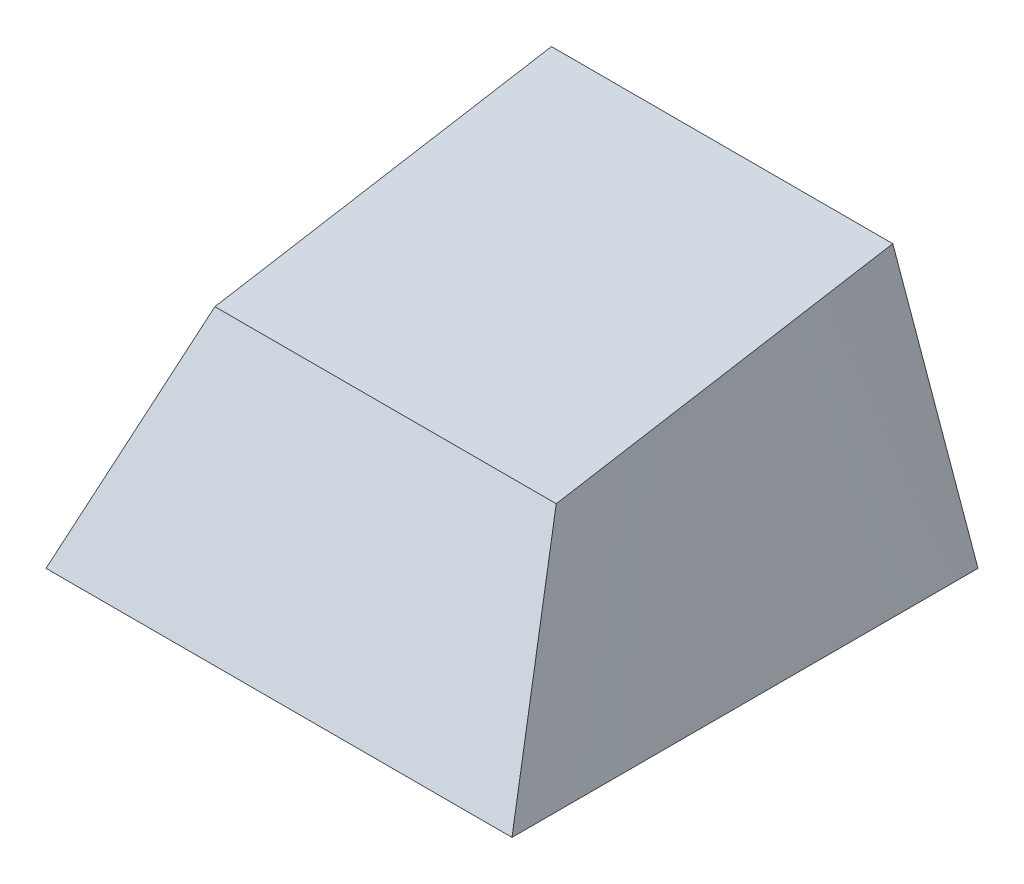
ISO-10303-21;
HEADER;
FILE_DESCRIPTION(('STEP AP214'),'2;1');
FILE_NAME('part.step','',(''),(''),'','','');
FILE_SCHEMA(('AUTOMOTIVE_DESIGN { 1 0 10303 214 1 1 1 1 }'));
ENDSEC;
DATA;
#1=APPLICATION_CONTEXT('core data for automotive mechanical design processes');
#2=APPLICATION_PROTOCOL_DEFINITION('international standard','automotive_design',2000,#1);
#3=PRODUCT_CONTEXT('',#1,'mechanical');
#4=PRODUCT('Part','Part','',(#3));
#5=PRODUCT_RELATED_PRODUCT_CATEGORY('part','',(#4));
#6=PRODUCT_DEFINITION_FORMATION('','',#4);
#7=PRODUCT_DEFINITION_CONTEXT('part definition',#1,'design');
#8=PRODUCT_DEFINITION('design','',#6,#7);
#9=PRODUCT_DEFINITION_SHAPE('','',#8);
#10=(LENGTH_UNIT() NAMED_UNIT(*) SI_UNIT(.MILLI.,.METRE.));
#11=(NAMED_UNIT(*) PLANE_ANGLE_UNIT() SI_UNIT($,.RADIAN.));
#12=(NAMED_UNIT(*) SI_UNIT($,.STERADIAN.) SOLID_ANGLE_UNIT());
#13=UNCERTAINTY_MEASURE_WITH_UNIT(LENGTH_MEASURE(1.E-05),#10,'distance_accuracy_value','');
#14=(GEOMETRIC_REPRESENTATION_CONTEXT(3) GLOBAL_UNCERTAINTY_ASSIGNED_CONTEXT((#13)) GLOBAL_UNIT_ASSIGNED_CONTEXT((#10,
#11,#12)) REPRESENTATION_CONTEXT('',''));
#15=CARTESIAN_POINT('',(0.,0.,0.));
#16=DIRECTION('',(0.,0.,1.));
#17=DIRECTION('',(1.,0.,0.));
#18=AXIS2_PLACEMENT_3D('',#15,#16,#17);
#19=CARTESIAN_POINT('',(0.,8.48350192905026,1.43566955722389));
#20=DIRECTION('',(0.,0.985980885458093,0.166858303692908));
#21=DIRECTION('',(0.,-0.166858303692908,0.985980885458093));
#22=AXIS2_PLACEMENT_3D('',#19,#20,#21);
#23=PLANE('',#22);
#24=DIRECTION('',(1.,0.,0.));
#25=VECTOR('',#24,1.);
#26=CARTESIAN_POINT('',(-6.59241988953979,7.9,4.88363550161177));
#27=LINE('',#26,#25);
#28=CARTESIAN_POINT('',(-6.59241988953979,7.9,4.88363550161177));
#29=VERTEX_POINT('',#28);
#30=CARTESIAN_POINT('',(6.5924198895398,7.9,4.88363550161176));
#31=VERTEX_POINT('',#30);
#32=EDGE_CURVE('E447',#29,#31,#27,.T.);
#33=ORIENTED_EDGE('',*,*,#32,.T.);
#34=DIRECTION('',(0.,0.166858303692908,-0.985980885458093));
#35=VECTOR('',#34,1.);
#36=CARTESIAN_POINT('',(6.5924198895398,7.9,4.88363550161176));
#37=LINE('',#36,#35);
#38=CARTESIAN_POINT('',(6.5924198895398,10.1,-8.11636449838823));
#39=VERTEX_POINT('',#38);
#40=EDGE_CURVE('E527',#31,#39,#37,.T.);
#41=ORIENTED_EDGE('',*,*,#40,.T.);
#42=DIRECTION('',(-1.,0.,0.));
#43=VECTOR('',#42,1.);
#44=CARTESIAN_POINT('',(-6.5924198895398,10.1,-8.11636449838823));
#45=LINE('',#44,#43);
#46=CARTESIAN_POINT('',(-6.5924198895398,10.1,-8.11636449838823));
#47=VERTEX_POINT('',#46);
#48=EDGE_CURVE('E63',#39,#47,#45,.T.);
#49=ORIENTED_EDGE('',*,*,#48,.T.);
#50=DIRECTION('',(0.,-0.166858303692908,0.985980885458093));
#51=VECTOR('',#50,1.);
#52=CARTESIAN_POINT('',(-6.59241988953979,7.9,4.88363550161177));
#53=LINE('',#52,#51);
#54=EDGE_CURVE('E14',#47,#29,#53,.T.);
#55=ORIENTED_EDGE('',*,*,#54,.T.);
#56=EDGE_LOOP('',(#33,#41,#49,#55));
#57=FACE_BOUND('',#56,.T.);
#58=ADVANCED_FACE('F52',(#57),#23,.T.);
#59=CARTESIAN_POINT('',(0.,0.,0.));
#60=DIRECTION('',(0.,1.,0.));
#61=DIRECTION('',(0.,0.,1.));
#62=AXIS2_PLACEMENT_3D('',#59,#60,#61);
#63=PLANE('',#62);
#64=DIRECTION('',(-1.,0.,0.));
#65=VECTOR('',#64,1.);
#66=CARTESIAN_POINT('',(0.,0.,-7.39388825993065));
#67=LINE('',#66,#65);
#68=CARTESIAN_POINT('',(7.35341894280521,-1.346579098227E-13,-7.3938882599308));
#69=VERTEX_POINT('',#68);
#70=CARTESIAN_POINT('',(-7.35341894280521,0.,-7.3938882599308));
#71=VERTEX_POINT('',#70);
#72=EDGE_CURVE('E751',#69,#71,#67,.T.);
#73=ORIENTED_EDGE('',*,*,#72,.T.);
#74=CARTESIAN_POINT('',(-7.3534189428052,0.,-7.3938882599308));
#75=CARTESIAN_POINT('',(-7.35138144162803,0.,-5.62573872568452));
#76=CARTESIAN_POINT('',(-7.34916787069443,0.,-3.85758932747076));
#77=CARTESIAN_POINT('',(-7.34451760340251,0.,-0.541895299182996));
#78=CARTESIAN_POINT('',(-7.34214320280169,0.,1.00564941974705));
#79=CARTESIAN_POINT('',(-7.33686552985169,0.,4.1007381145957));
#80=CARTESIAN_POINT('',(-7.33396225744588,0.,5.64828209051421));
#81=CARTESIAN_POINT('',(-7.33073407922755,0.,7.19582544865283));
#82=B_SPLINE_CURVE_WITH_KNOTS('',3,(#74,#75,#76,#77,#78,#79,#80,#81),.UNSPECIFIED.,.F.,.F.,(4,2,
2,4),(0.,5.30445222136777,9.94709177247256,14.5897318206672),.UNSPECIFIED.);
#83=CARTESIAN_POINT('',(-7.33073407922755,0.,7.19582544865283));
#84=VERTEX_POINT('',#83);
#85=EDGE_CURVE('E346',#71,#84,#82,.T.);
#86=ORIENTED_EDGE('',*,*,#85,.T.);
#87=DIRECTION('',(1.,0.,0.));
#88=VECTOR('',#87,1.);
#89=CARTESIAN_POINT('',(0.,0.,7.19582544865283));
#90=LINE('',#89,#88);
#91=CARTESIAN_POINT('',(7.33073407922755,0.,7.19582544865283));
#92=VERTEX_POINT('',#91);
#93=EDGE_CURVE('E752',#84,#92,#90,.T.);
#94=ORIENTED_EDGE('',*,*,#93,.T.);
#95=CARTESIAN_POINT('',(7.33073407922755,0.,7.19582544865283));
#96=CARTESIAN_POINT('',(7.33442892797053,0.,5.42324138907455));
#97=CARTESIAN_POINT('',(7.33770049917733,0.,3.65065653466032));
#98=CARTESIAN_POINT('',(7.34319794320016,0.,0.332745254032284));
#99=CARTESIAN_POINT('',(7.34550410713694,0.,-1.21258103787753));
#100=CARTESIAN_POINT('',(7.34972540879217,0.,-4.30323426860638));
#101=CARTESIAN_POINT('',(7.35164054648333,0.,-5.84856120742546));
#102=CARTESIAN_POINT('',(7.3534189428052,0.,-7.3938882599308));
#103=B_SPLINE_CURVE_WITH_KNOTS('',3,(#95,#96,#97,#98,#99,#100,#101,#102),.UNSPECIFIED.,.F.,.F.,
(4,2,2,4),(0.,5.31776354976349,9.9537475201381,14.5897318141445),.UNSPECIFIED.);
#104=EDGE_CURVE('E744',#92,#69,#103,.T.);
#105=ORIENTED_EDGE('',*,*,#104,.T.);
#106=EDGE_LOOP('',(#73,#86,#94,#105));
#107=FACE_BOUND('',#106,.T.);
#108=DIRECTION('',(0.,0.,1.));
#109=VECTOR('',#108,1.);
#110=CARTESIAN_POINT('',(-9.,0.,-9.));
#111=LINE('',#110,#109);
#112=CARTESIAN_POINT('',(-9.,0.,-9.));
#113=VERTEX_POINT('',#112);
#114=CARTESIAN_POINT('',(-9.,0.,9.));
#115=VERTEX_POINT('',#114);
#116=EDGE_CURVE('E463',#113,#115,#111,.T.);
#117=ORIENTED_EDGE('',*,*,#116,.F.);
#118=DIRECTION('',(-1.,0.,0.));
#119=VECTOR('',#118,1.);
#120=CARTESIAN_POINT('',(-9.,0.,-9.));
#121=LINE('',#120,#119);
#122=CARTESIAN_POINT('',(9.,0.,-9.));
#123=VERTEX_POINT('',#122);
#124=EDGE_CURVE('E455',#123,#113,#121,.T.);
#125=ORIENTED_EDGE('',*,*,#124,.F.);
#126=DIRECTION('',(0.,0.,-1.));
#127=VECTOR('',#126,1.);
#128=CARTESIAN_POINT('',(9.,0.,-9.));
#129=LINE('',#128,#127);
#130=CARTESIAN_POINT('',(9.,0.,9.));
#131=VERTEX_POINT('',#130);
#132=EDGE_CURVE('E496',#131,#123,#129,.T.);
#133=ORIENTED_EDGE('',*,*,#132,.F.);
#134=DIRECTION('',(1.,0.,0.));
#135=VECTOR('',#134,1.);
#136=CARTESIAN_POINT('',(-9.,0.,9.));
#137=LINE('',#136,#135);
#138=EDGE_CURVE('E481',#115,#131,#137,.T.);
#139=ORIENTED_EDGE('',*,*,#138,.F.);
#140=EDGE_LOOP('',(#117,#125,#133,#139));
#141=FACE_BOUND('',#140,.T.);
#142=ADVANCED_FACE('F530',(#107,#141),#63,.F.);
#143=CARTESIAN_POINT('',(-9.,0.,-9.));
#144=CARTESIAN_POINT('',(-6.5924198895398,10.1,-8.11636449838823));
#145=CARTESIAN_POINT('',(-9.,0.,-6.));
#146=CARTESIAN_POINT('',(-6.5924198895398,9.73333333333334,-5.94969783172159));
#147=CARTESIAN_POINT('',(-9.,0.,-3.));
#148=CARTESIAN_POINT('',(-6.5924198895398,9.36666666666667,-3.78303116505494));
#149=CARTESIAN_POINT('',(-9.,0.,3.));
#150=CARTESIAN_POINT('',(-6.5924198895398,8.63333333333334,0.550302168278397));
#151=CARTESIAN_POINT('',(-9.,0.,6.));
#152=CARTESIAN_POINT('',(-6.5924198895398,8.26666666666667,2.71696883494508));
#153=CARTESIAN_POINT('',(-9.,0.,9.));
#154=CARTESIAN_POINT('',(-6.59241988953979,7.9,4.88363550161177));
#155=B_SPLINE_SURFACE_WITH_KNOTS('',3,1,((#143,#144),(#145,#146),(#147,#148),(#149,#150),(#151,
#152),(#153,#154)),.UNSPECIFIED.,.F.,.F.,.F.,(4,2,4),(2,2),(0.,0.5,1.),(0.,1.),.UNSPECIFIED.);
#156=DIRECTION('',(0.260907238987357,0.856115723437394,-0.446086629173373));
#157=VECTOR('',#156,1.);
#158=CARTESIAN_POINT('',(-7.7962099447699,3.95,6.94181775080588));
#159=LINE('',#158,#157);
#160=EDGE_CURVE('E454',#115,#29,#159,.T.);
#161=DIRECTION('',(-0.231042205786163,-0.969241384036106,-0.0847976333233296));
#162=VECTOR('',#161,1.);
#163=CARTESIAN_POINT('',(-7.7962099447699,5.05,-8.55818224919411));
#164=LINE('',#163,#162);
#165=EDGE_CURVE('E451',#47,#113,#164,.T.);
#166=ORIENTED_EDGE('',*,*,#116,.T.);
#167=ORIENTED_EDGE('',*,*,#160,.T.);
#168=ORIENTED_EDGE('',*,*,#54,.F.);
#169=ORIENTED_EDGE('',*,*,#165,.T.);
#170=EDGE_LOOP('',(#166,#167,#168,#169));
#171=FACE_BOUND('',#170,.T.);
#172=ADVANCED_FACE('F386',(#171),#155,.T.);
#173=CARTESIAN_POINT('',(0.,3.68817994687276,7.07824139278805));
#174=DIRECTION('',(0.,-0.462091694509501,-0.886832152025026));
#175=DIRECTION('',(0.,0.886832152025026,-0.462091694509501));
#176=AXIS2_PLACEMENT_3D('',#173,#174,#175);
#177=PLANE('',#176);
#178=DIRECTION('',(-0.260907238987356,0.856115723437394,-0.446086629173373));
#179=VECTOR('',#178,1.);
#180=CARTESIAN_POINT('',(9.,0.,9.));
#181=LINE('',#180,#179);
#182=EDGE_CURVE('E448',#131,#31,#181,.T.);
#183=ORIENTED_EDGE('',*,*,#182,.T.);
#184=ORIENTED_EDGE('',*,*,#32,.F.);
#185=ORIENTED_EDGE('',*,*,#160,.F.);
#186=ORIENTED_EDGE('',*,*,#138,.T.);
#187=EDGE_LOOP('',(#183,#184,#185,#186));
#188=FACE_BOUND('',#187,.T.);
#189=ADVANCED_FACE('F428',(#188),#177,.F.);
#190=CARTESIAN_POINT('',(0.,0.781416799501128,-8.93163488855495));
#191=DIRECTION('',(0.,-0.0871557427476516,0.996194698091746));
#192=DIRECTION('',(0.,-0.996194698091746,-0.0871557427476516));
#193=AXIS2_PLACEMENT_3D('',#190,#191,#192);
#194=PLANE('',#193);
#195=ORIENTED_EDGE('',*,*,#165,.F.);
#196=ORIENTED_EDGE('',*,*,#48,.F.);
#197=DIRECTION('',(-0.231042205786163,0.969241384036106,0.0847976333233293));
#198=VECTOR('',#197,1.);
#199=CARTESIAN_POINT('',(7.7962099447699,5.05,-8.55818224919412));
#200=LINE('',#199,#198);
#201=EDGE_CURVE('E439',#123,#39,#200,.T.);
#202=ORIENTED_EDGE('',*,*,#201,.F.);
#203=ORIENTED_EDGE('',*,*,#124,.T.);
#204=EDGE_LOOP('',(#195,#196,#202,#203));
#205=FACE_BOUND('',#204,.T.);
#206=ADVANCED_FACE('F384',(#205),#194,.F.);
#207=CARTESIAN_POINT('',(9.,0.,9.));
#208=CARTESIAN_POINT('',(6.5924198895398,7.9,4.88363550161176));
#209=CARTESIAN_POINT('',(9.,0.,6.));
#210=CARTESIAN_POINT('',(6.5924198895398,8.26666666666667,2.7169688349451));
#211=CARTESIAN_POINT('',(9.,0.,3.));
#212=CARTESIAN_POINT('',(6.5924198895398,8.63333333333333,0.550302168278436));
#213=CARTESIAN_POINT('',(9.,0.,-3.));
#214=CARTESIAN_POINT('',(6.5924198895398,9.36666666666667,-3.7830311650549));
#215=CARTESIAN_POINT('',(9.,0.,-6.));
#216=CARTESIAN_POINT('',(6.5924198895398,9.73333333333333,-5.94969783172156));
#217=CARTESIAN_POINT('',(9.,0.,-9.));
#218=CARTESIAN_POINT('',(6.5924198895398,10.1,-8.11636449838823));
#219=B_SPLINE_SURFACE_WITH_KNOTS('',3,1,((#207,#208),(#209,#210),(#211,#212),(#213,#214),(#215,
#216),(#217,#218)),.UNSPECIFIED.,.F.,.F.,.F.,(4,2,4),(2,2),(0.,0.5,1.),(0.,1.),.UNSPECIFIED.);
#220=ORIENTED_EDGE('',*,*,#132,.T.);
#221=ORIENTED_EDGE('',*,*,#201,.T.);
#222=ORIENTED_EDGE('',*,*,#40,.F.);
#223=ORIENTED_EDGE('',*,*,#182,.F.);
#224=EDGE_LOOP('',(#220,#221,#222,#223));
#225=FACE_BOUND('',#224,.T.);
#226=ADVANCED_FACE('F379',(#225),#219,.T.);
#227=CARTESIAN_POINT('',(0.,6.90593251231731,1.16869627131524));
#228=DIRECTION('',(0.,0.985980885458093,0.166858303692908));
#229=DIRECTION('',(0.,-0.166858303692908,0.985980885458093));
#230=AXIS2_PLACEMENT_3D('',#227,#228,#229);
#231=PLANE('',#230);
#232=CARTESIAN_POINT('',(0.,7.10371188130912,0.));
#233=DIRECTION('',(0.,0.985980885458093,0.166858303692908));
#234=DIRECTION('',(0.,-0.166858303692908,0.985980885458093));
#235=AXIS2_PLACEMENT_3D('',#232,#233,#234);
#236=ELLIPSE('',#235,1.52132766681688,1.5);
#237=CARTESIAN_POINT('',(0.,6.84986572746296,1.5));
#238=VERTEX_POINT('',#237);
#239=EDGE_CURVE('E342',#238,#238,#236,.F.);
#240=ORIENTED_EDGE('',*,*,#239,.F.);
#241=EDGE_LOOP('',(#240));
#242=FACE_BOUND('',#241,.T.);
#243=DIRECTION('',(1.,0.,0.));
#244=VECTOR('',#243,1.);
#245=CARTESIAN_POINT('',(0.,6.45516825589243,3.83230324109861));
#246=LINE('',#245,#244);
#247=CARTESIAN_POINT('',(-5.42799400595446,6.45516825589243,3.83230324109861));
#248=VERTEX_POINT('',#247);
#249=CARTESIAN_POINT('',(5.42799400595447,6.45516825589243,3.83230324109861));
#250=VERTEX_POINT('',#249);
#251=EDGE_CURVE('E347',#248,#250,#246,.T.);
#252=ORIENTED_EDGE('',*,*,#251,.F.);
#253=CARTESIAN_POINT('',(-5.33943561858975,8.23308803972577,-6.67358639064383));
#254=CARTESIAN_POINT('',(-5.34539422303138,8.08492636337555,-5.79808557584711));
#255=CARTESIAN_POINT('',(-5.35163779788194,7.93676499418613,-4.92258657609146));
#256=CARTESIAN_POINT('',(-5.36479617387936,7.64044320324157,-3.17159417505542));
#257=CARTESIAN_POINT('',(-5.37171097450322,7.49228278148578,-2.2961007737712));
#258=CARTESIAN_POINT('',(-5.38631311759912,7.19596255938172,-0.545117643156276));
#259=CARTESIAN_POINT('',(-5.39400046230413,7.04780275903648,0.330372086156506));
#260=CARTESIAN_POINT('',(-5.410282759589,6.75148443525284,2.08134399942342));
#261=CARTESIAN_POINT('',(-5.41887771287604,6.60332591181554,2.95682618337115));
#262=CARTESIAN_POINT('',(-5.42799400595446,6.45516825589243,3.83230324109861));
#263=B_SPLINE_CURVE_WITH_KNOTS('',3,(#253,#254,#255,#256,#257,#258,#259,#260,#261,#262),
.UNSPECIFIED.,.F.,.F.,(4,2,2,2,4),(0.,2.66390725698839,5.32781243836378,7.99172531973815,
10.6556402767371),.UNSPECIFIED.);
#264=CARTESIAN_POINT('',(-5.33943561858974,8.23308803972577,-6.67358639064382));
#265=VERTEX_POINT('',#264);
#266=EDGE_CURVE('E768',#265,#248,#263,.T.);
#267=ORIENTED_EDGE('',*,*,#266,.F.);
#268=DIRECTION('',(-1.,0.,0.));
#269=VECTOR('',#268,1.);
#270=CARTESIAN_POINT('',(0.,8.23308803972576,-6.67358639064382));
#271=LINE('',#270,#269);
#272=CARTESIAN_POINT('',(5.33943561858975,8.23308803972576,-6.67358639064382));
#273=VERTEX_POINT('',#272);
#274=EDGE_CURVE('E361',#273,#265,#271,.T.);
#275=ORIENTED_EDGE('',*,*,#274,.F.);
#276=CARTESIAN_POINT('',(5.42799400595447,6.45516825589243,3.83230324109861));
#277=CARTESIAN_POINT('',(5.4188777415134,6.60332544560886,2.95682893822878));
#278=CARTESIAN_POINT('',(5.41028281364808,6.75148350283425,2.08134950916966));
#279=CARTESIAN_POINT('',(5.39400056192844,7.04780089418707,0.330383105721186));
#280=CARTESIAN_POINT('',(5.38631323736695,7.19596022831341,-0.545103868661752));
#281=CARTESIAN_POINT('',(5.37171108448456,7.49228045040397,-2.29608699919688));
#282=CARTESIAN_POINT('',(5.36479625879248,7.64044133837176,-3.17158315537018));
#283=CARTESIAN_POINT('',(5.35163783719837,7.93676406174703,-4.92258106622401));
#284=CARTESIAN_POINT('',(5.34539424181934,8.08492589715515,-5.79808282090837));
#285=CARTESIAN_POINT('',(5.33943561858975,8.23308803972576,-6.67358639064382));
#286=B_SPLINE_CURVE_WITH_KNOTS('',3,(#276,#277,#278,#279,#280,#281,#282,#283,#284,#285),
.UNSPECIFIED.,.F.,.F.,(4,2,2,2,4),(0.,2.66390657448004,5.32781107334719,7.99172463722881,
10.6556402767378),.UNSPECIFIED.);
#287=EDGE_CURVE('E350',#250,#273,#286,.T.);
#288=ORIENTED_EDGE('',*,*,#287,.F.);
#289=EDGE_LOOP('',(#252,#267,#275,#288));
#290=FACE_BOUND('',#289,.T.);
#291=ADVANCED_FACE('F363',(#242,#290),#231,.F.);
#292=CARTESIAN_POINT('',(-9.,0.,-9.));
#293=CARTESIAN_POINT('',(-6.5924198895398,10.1,-8.11636449838823));
#294=CARTESIAN_POINT('',(-9.,0.,-6.));
#295=CARTESIAN_POINT('',(-6.5924198895398,9.73333333333334,-5.94969783172159));
#296=CARTESIAN_POINT('',(-9.,0.,-3.));
#297=CARTESIAN_POINT('',(-6.5924198895398,9.36666666666667,-3.78303116505494));
#298=CARTESIAN_POINT('',(-9.,0.,3.));
#299=CARTESIAN_POINT('',(-6.5924198895398,8.63333333333334,0.550302168278397));
#300=CARTESIAN_POINT('',(-9.,0.,6.));
#301=CARTESIAN_POINT('',(-6.5924198895398,8.26666666666667,2.71696883494508));
#302=CARTESIAN_POINT('',(-9.,0.,9.));
#303=CARTESIAN_POINT('',(-6.59241988953979,7.9,4.88363550161177));
#304=B_SPLINE_SURFACE_WITH_KNOTS('',3,1,((#292,#293),(#294,#295),(#296,#297),(#298,#299),(#300,
#301),(#302,#303)),.UNSPECIFIED.,.F.,.F.,.F.,(4,2,4),(2,2),(0.,0.5,1.),(0.,1.),.UNSPECIFIED.);
#305=OFFSET_SURFACE('',#304,-1.6,.F.);
#306=ORIENTED_EDGE('',*,*,#85,.F.);
#307=CARTESIAN_POINT('',(-5.33943561858975,8.23308803972577,-6.67358639064383));
#308=CARTESIAN_POINT('',(-5.55035387009889,7.37780765762129,-6.74841372821392));
#309=CARTESIAN_POINT('',(-5.76064703879963,6.52237472728134,-6.82325441202539));
#310=CARTESIAN_POINT('',(-6.20195773173519,4.72259839109831,-6.98071443832366));
#311=CARTESIAN_POINT('',(-6.43286449642953,3.77822802755507,-7.06333613930363));
#312=CARTESIAN_POINT('',(-6.89375522810992,1.88926275677549,-7.22859918629112));
#313=CARTESIAN_POINT('',(-7.12373919413108,0.944667849305458,-7.3112405323191));
#314=CARTESIAN_POINT('',(-7.35341894280522,0.,-7.39388825993065));
#315=B_SPLINE_CURVE_WITH_KNOTS('',3,(#307,#308,#309,#310,#311,#312,#313,#314),.UNSPECIFIED.,.F.,
.F.,(4,2,2,4),(0.,2.65222676851535,5.5793094776204,8.50639524653459),.UNSPECIFIED.);
#316=EDGE_CURVE('E764',#265,#71,#315,.T.);
#317=ORIENTED_EDGE('',*,*,#316,.F.);
#318=ORIENTED_EDGE('',*,*,#266,.T.);
#319=CARTESIAN_POINT('',(-7.33073407922755,0.,7.19582544865283));
#320=CARTESIAN_POINT('',(-7.1053895459098,0.758129267050054,6.80079552459284));
#321=CARTESIAN_POINT('',(-6.88045990796542,1.51635630982733,6.40571465363002));
#322=CARTESIAN_POINT('',(-6.45017982481814,2.97117082504217,5.64767075208948));
#323=CARTESIAN_POINT('',(-6.24473054706996,3.66773531821386,5.2847196950604));
#324=CARTESIAN_POINT('',(-5.83522999095972,5.06118947438239,4.55864814840424));
#325=CARTESIAN_POINT('',(-5.63117871664425,5.75807913831422,4.19552765828998));
#326=CARTESIAN_POINT('',(-5.42799400595446,6.45516825589243,3.83230324109862));
#327=B_SPLINE_CURVE_WITH_KNOTS('',3,(#319,#320,#321,#322,#323,#324,#325,#326),.UNSPECIFIED.,.F.,
.F.,(4,2,2,4),(0.,2.65222658126589,5.08785788301822,7.52349623183257),.UNSPECIFIED.);
#328=EDGE_CURVE('E767',#84,#248,#327,.T.);
#329=ORIENTED_EDGE('',*,*,#328,.F.);
#330=EDGE_LOOP('',(#306,#317,#318,#329));
#331=FACE_BOUND('',#330,.T.);
#332=ADVANCED_FACE('F373',(#331),#305,.F.);
#333=CARTESIAN_POINT('',(0.,2.94883323565756,5.65930994954801));
#334=DIRECTION('',(0.,-0.462091694509501,-0.886832152025026));
#335=DIRECTION('',(0.,0.886832152025026,-0.462091694509501));
#336=AXIS2_PLACEMENT_3D('',#333,#334,#335);
#337=PLANE('',#336);
#338=CARTESIAN_POINT('',(7.33073407922755,0.,7.19582544865283));
#339=CARTESIAN_POINT('',(7.10482417349759,0.760031777350602,6.79980420486385));
#340=CARTESIAN_POINT('',(6.87933113278678,1.52016179601737,6.40373177157282));
#341=CARTESIAN_POINT('',(6.44877562947897,2.97592926228989,5.64519132650032));
#342=CARTESIAN_POINT('',(6.24360962843919,3.67154263697896,5.28273585812385));
#343=CARTESIAN_POINT('',(5.83467232219239,5.06309378293822,4.55765589167851));
#344=CARTESIAN_POINT('',(5.63090102101477,5.75903155513943,4.19503139312453));
#345=CARTESIAN_POINT('',(5.42799400595447,6.45516825589243,3.83230324109861));
#346=B_SPLINE_CURVE_WITH_KNOTS('',3,(#338,#339,#340,#341,#342,#343,#344,#345),.UNSPECIFIED.,.F.,
.F.,(4,2,2,4),(0.,2.65888219853341,5.0911857035178,7.52349623264637),.UNSPECIFIED.);
#347=EDGE_CURVE('E85',#92,#250,#346,.T.);
#348=ORIENTED_EDGE('',*,*,#347,.F.);
#349=ORIENTED_EDGE('',*,*,#93,.F.);
#350=ORIENTED_EDGE('',*,*,#328,.T.);
#351=ORIENTED_EDGE('',*,*,#251,.T.);
#352=EDGE_LOOP('',(#348,#349,#350,#351));
#353=FACE_BOUND('',#352,.T.);
#354=ADVANCED_FACE('F560',(#353),#337,.T.);
#355=CARTESIAN_POINT('',(0.,0.641967611104885,-7.33772337160815));
#356=DIRECTION('',(0.,-0.0871557427476516,0.996194698091746));
#357=DIRECTION('',(0.,-0.996194698091746,-0.0871557427476516));
#358=AXIS2_PLACEMENT_3D('',#355,#356,#357);
#359=PLANE('',#358);
#360=ORIENTED_EDGE('',*,*,#316,.T.);
#361=ORIENTED_EDGE('',*,*,#72,.F.);
#362=CARTESIAN_POINT('',(7.35341894280523,-1.4277790960578E-13,-7.39388825993066));
#363=CARTESIAN_POINT('',(7.14478796883499,0.858110446537223,-7.3188133238055));
#364=CARTESIAN_POINT('',(6.93590254572301,1.71615984061458,-7.24374372907844));
#365=CARTESIAN_POINT('',(6.4965456667623,3.51754768555666,-7.08614271403259));
#366=CARTESIAN_POINT('',(6.2659967805156,4.4608673926067,-7.00361293358509));
#367=CARTESIAN_POINT('',(5.80369561371954,6.34721551759625,-6.83857885718511));
#368=CARTESIAN_POINT('',(5.57194333140767,7.29024393510698,-6.75607456127015));
#369=CARTESIAN_POINT('',(5.33943561858975,8.23308803972576,-6.67358639064382));
#370=B_SPLINE_CURVE_WITH_KNOTS('',3,(#362,#363,#364,#365,#366,#367,#368,#369),.UNSPECIFIED.,.F.,
.F.,(4,2,2,4),(0.,2.65888187973236,5.58263640654219,8.50639521673185),.UNSPECIFIED.);
#371=EDGE_CURVE('E351',#69,#273,#370,.T.);
#372=ORIENTED_EDGE('',*,*,#371,.T.);
#373=ORIENTED_EDGE('',*,*,#274,.T.);
#374=EDGE_LOOP('',(#360,#361,#372,#373));
#375=FACE_BOUND('',#374,.T.);
#376=ADVANCED_FACE('F371',(#375),#359,.T.);
#377=CARTESIAN_POINT('',(9.,0.,9.));
#378=CARTESIAN_POINT('',(6.5924198895398,7.9,4.88363550161176));
#379=CARTESIAN_POINT('',(9.,0.,6.));
#380=CARTESIAN_POINT('',(6.5924198895398,8.26666666666667,2.7169688349451));
#381=CARTESIAN_POINT('',(9.,0.,3.));
#382=CARTESIAN_POINT('',(6.5924198895398,8.63333333333333,0.550302168278436));
#383=CARTESIAN_POINT('',(9.,0.,-3.));
#384=CARTESIAN_POINT('',(6.5924198895398,9.36666666666667,-3.7830311650549));
#385=CARTESIAN_POINT('',(9.,0.,-6.));
#386=CARTESIAN_POINT('',(6.5924198895398,9.73333333333333,-5.94969783172156));
#387=CARTESIAN_POINT('',(9.,0.,-9.));
#388=CARTESIAN_POINT('',(6.5924198895398,10.1,-8.11636449838823));
#389=B_SPLINE_SURFACE_WITH_KNOTS('',3,1,((#377,#378),(#379,#380),(#381,#382),(#383,#384),(#385,
#386),(#387,#388)),.UNSPECIFIED.,.F.,.F.,.F.,(4,2,4),(2,2),(0.,0.5,1.),(0.,1.),.UNSPECIFIED.);
#390=OFFSET_SURFACE('',#389,-1.6,.F.);
#391=ORIENTED_EDGE('',*,*,#104,.F.);
#392=ORIENTED_EDGE('',*,*,#347,.T.);
#393=ORIENTED_EDGE('',*,*,#287,.T.);
#394=ORIENTED_EDGE('',*,*,#371,.F.);
#395=EDGE_LOOP('',(#391,#392,#393,#394));
#396=FACE_BOUND('',#395,.T.);
#397=ADVANCED_FACE('F366',(#396),#390,.F.);
#398=CARTESIAN_POINT('',(0.,2.,0.));
#399=DIRECTION('',(0.,-1.,0.));
#400=DIRECTION('',(0.,0.,-1.));
#401=AXIS2_PLACEMENT_3D('',#398,#399,#400);
#402=PLANE('',#401);
#403=DIRECTION('',(1.,0.,0.));
#404=VECTOR('',#403,1.);
#405=CARTESIAN_POINT('',(0.,2.,-0.5));
#406=LINE('',#405,#404);
#407=CARTESIAN_POINT('',(-1.25,2.,-0.5));
#408=VERTEX_POINT('',#407);
#409=CARTESIAN_POINT('',(-0.5,2.,-0.5));
#410=VERTEX_POINT('',#409);
#411=EDGE_CURVE('E251',#408,#410,#406,.T.);
#412=ORIENTED_EDGE('',*,*,#411,.F.);
#413=DIRECTION('',(0.,0.,-1.));
#414=VECTOR('',#413,1.);
#415=CARTESIAN_POINT('',(-1.25,2.,0.));
#416=LINE('',#415,#414);
#417=CARTESIAN_POINT('',(-1.25,2.,0.5));
#418=VERTEX_POINT('',#417);
#419=EDGE_CURVE('E269',#418,#408,#416,.T.);
#420=ORIENTED_EDGE('',*,*,#419,.F.);
#421=DIRECTION('',(1.,0.,0.));
#422=VECTOR('',#421,1.);
#423=CARTESIAN_POINT('',(0.,2.,0.5));
#424=LINE('',#423,#422);
#425=CARTESIAN_POINT('',(-0.5,2.,0.5));
#426=VERTEX_POINT('',#425);
#427=EDGE_CURVE('E74',#418,#426,#424,.T.);
#428=ORIENTED_EDGE('',*,*,#427,.T.);
#429=DIRECTION('',(0.,0.,-1.));
#430=VECTOR('',#429,1.);
#431=CARTESIAN_POINT('',(-0.5,2.,0.));
#432=LINE('',#431,#430);
#433=CARTESIAN_POINT('',(-0.5,2.,1.25));
#434=VERTEX_POINT('',#433);
#435=EDGE_CURVE('E260',#434,#426,#432,.T.);
#436=ORIENTED_EDGE('',*,*,#435,.F.);
#437=DIRECTION('',(1.,0.,0.));
#438=VECTOR('',#437,1.);
#439=CARTESIAN_POINT('',(0.,2.,1.25));
#440=LINE('',#439,#438);
#441=CARTESIAN_POINT('',(0.5,2.,1.25));
#442=VERTEX_POINT('',#441);
#443=EDGE_CURVE('E283',#434,#442,#440,.T.);
#444=ORIENTED_EDGE('',*,*,#443,.T.);
#445=DIRECTION('',(0.,0.,-1.));
#446=VECTOR('',#445,1.);
#447=CARTESIAN_POINT('',(0.5,2.,0.));
#448=LINE('',#447,#446);
#449=CARTESIAN_POINT('',(0.5,2.,0.5));
#450=VERTEX_POINT('',#449);
#451=EDGE_CURVE('E315',#442,#450,#448,.T.);
#452=ORIENTED_EDGE('',*,*,#451,.T.);
#453=DIRECTION('',(1.,0.,0.));
#454=VECTOR('',#453,1.);
#455=CARTESIAN_POINT('',(0.,2.,0.5));
#456=LINE('',#455,#454);
#457=CARTESIAN_POINT('',(1.25,2.,0.5));
#458=VERTEX_POINT('',#457);
#459=EDGE_CURVE('E319',#450,#458,#456,.T.);
#460=ORIENTED_EDGE('',*,*,#459,.T.);
#461=DIRECTION('',(0.,0.,-1.));
#462=VECTOR('',#461,1.);
#463=CARTESIAN_POINT('',(1.25,2.,0.));
#464=LINE('',#463,#462);
#465=CARTESIAN_POINT('',(1.25,2.,-0.5));
#466=VERTEX_POINT('',#465);
#467=EDGE_CURVE('E323',#458,#466,#464,.T.);
#468=ORIENTED_EDGE('',*,*,#467,.T.);
#469=DIRECTION('',(1.,0.,0.));
#470=VECTOR('',#469,1.);
#471=CARTESIAN_POINT('',(0.,2.,-0.5));
#472=LINE('',#471,#470);
#473=CARTESIAN_POINT('',(0.5,2.,-0.5));
#474=VERTEX_POINT('',#473);
#475=EDGE_CURVE('E265',#474,#466,#472,.T.);
#476=ORIENTED_EDGE('',*,*,#475,.F.);
#477=DIRECTION('',(0.,0.,-1.));
#478=VECTOR('',#477,1.);
#479=CARTESIAN_POINT('',(0.5,2.,0.));
#480=LINE('',#479,#478);
#481=CARTESIAN_POINT('',(0.5,2.,-1.25));
#482=VERTEX_POINT('',#481);
#483=EDGE_CURVE('E300',#474,#482,#480,.T.);
#484=ORIENTED_EDGE('',*,*,#483,.T.);
#485=DIRECTION('',(1.,0.,0.));
#486=VECTOR('',#485,1.);
#487=CARTESIAN_POINT('',(0.,2.,-1.25));
#488=LINE('',#487,#486);
#489=CARTESIAN_POINT('',(-0.5,2.,-1.25));
#490=VERTEX_POINT('',#489);
#491=EDGE_CURVE('E917',#490,#482,#488,.T.);
#492=ORIENTED_EDGE('',*,*,#491,.F.);
#493=DIRECTION('',(0.,0.,-1.));
#494=VECTOR('',#493,1.);
#495=CARTESIAN_POINT('',(-0.5,2.,0.));
#496=LINE('',#495,#494);
#497=EDGE_CURVE('E897',#410,#490,#496,.T.);
#498=ORIENTED_EDGE('',*,*,#497,.F.);
#499=EDGE_LOOP('',(#412,#420,#428,#436,#444,#452,#460,#468,#476,#484,#492,#498));
#500=FACE_BOUND('',#499,.T.);
#501=CARTESIAN_POINT('',(0.,2.,0.));
#502=DIRECTION('',(0.,-1.,0.));
#503=DIRECTION('',(0.,0.,-1.));
#504=AXIS2_PLACEMENT_3D('',#501,#502,#503);
#505=CIRCLE('',#504,1.5);
#506=CARTESIAN_POINT('',(0.,2.,-1.5));
#507=VERTEX_POINT('',#506);
#508=EDGE_CURVE('E338',#507,#507,#505,.T.);
#509=ORIENTED_EDGE('',*,*,#508,.T.);
#510=EDGE_LOOP('',(#509));
#511=FACE_BOUND('',#510,.T.);
#512=ADVANCED_FACE('F370',(#500,#511),#402,.T.);
#513=CARTESIAN_POINT('',(0.,11.3765144440946,0.));
#514=DIRECTION('',(0.,-1.,0.));
#515=DIRECTION('',(0.,0.,-1.));
#516=AXIS2_PLACEMENT_3D('',#513,#514,#515);
#517=CYLINDRICAL_SURFACE('',#516,1.5);
#518=ORIENTED_EDGE('',*,*,#508,.F.);
#519=EDGE_LOOP('',(#518));
#520=FACE_BOUND('',#519,.T.);
#521=ORIENTED_EDGE('',*,*,#239,.T.);
#522=EDGE_LOOP('',(#521));
#523=FACE_BOUND('',#522,.T.);
#524=ADVANCED_FACE('F576',(#520,#523),#517,.T.);
#525=CARTESIAN_POINT('',(0.,6.41294206958826,1.08526711946878));
#526=DIRECTION('',(0.,0.985980885458093,0.166858303692908));
#527=DIRECTION('',(0.,-0.166858303692908,0.985980885458093));
#528=AXIS2_PLACEMENT_3D('',#525,#526,#527);
#529=PLANE('',#528);
#530=DIRECTION('',(0.,0.166858303692908,-0.985980885458093));
#531=VECTOR('',#530,1.);
#532=CARTESIAN_POINT('',(-1.25,6.70965855528185,-0.66805756872059));
#533=LINE('',#532,#531);
#534=CARTESIAN_POINT('',(-1.25,6.51198727442144,0.5));
#535=VERTEX_POINT('',#534);
#536=CARTESIAN_POINT('',(-1.25,6.68121804365221,-0.5));
#537=VERTEX_POINT('',#536);
#538=EDGE_CURVE('E257',#535,#537,#533,.T.);
#539=ORIENTED_EDGE('',*,*,#538,.T.);
#540=DIRECTION('',(1.,0.,0.));
#541=VECTOR('',#540,1.);
#542=CARTESIAN_POINT('',(0.,6.68121804365221,-0.5));
#543=LINE('',#542,#541);
#544=CARTESIAN_POINT('',(-0.5,6.68121804365221,-0.5));
#545=VERTEX_POINT('',#544);
#546=EDGE_CURVE('E248',#537,#545,#543,.T.);
#547=ORIENTED_EDGE('',*,*,#546,.T.);
#548=DIRECTION('',(0.,0.166858303692908,-0.985980885458093));
#549=VECTOR('',#548,1.);
#550=CARTESIAN_POINT('',(-0.5,6.70965855528185,-0.66805756872059));
#551=LINE('',#550,#549);
#552=CARTESIAN_POINT('',(-0.5,6.80814112057529,-1.25));
#553=VERTEX_POINT('',#552);
#554=EDGE_CURVE('E234',#545,#553,#551,.T.);
#555=ORIENTED_EDGE('',*,*,#554,.T.);
#556=DIRECTION('',(1.,0.,0.));
#557=VECTOR('',#556,1.);
#558=CARTESIAN_POINT('',(0.,6.80814112057529,-1.25));
#559=LINE('',#558,#557);
#560=CARTESIAN_POINT('',(0.5,6.80814112057529,-1.25));
#561=VERTEX_POINT('',#560);
#562=EDGE_CURVE('E303',#553,#561,#559,.T.);
#563=ORIENTED_EDGE('',*,*,#562,.T.);
#564=DIRECTION('',(0.,0.166858303692908,-0.985980885458093));
#565=VECTOR('',#564,1.);
#566=CARTESIAN_POINT('',(0.5,6.70965855528185,-0.66805756872059));
#567=LINE('',#566,#565);
#568=CARTESIAN_POINT('',(0.5,6.68121804365221,-0.5));
#569=VERTEX_POINT('',#568);
#570=EDGE_CURVE('E294',#569,#561,#567,.T.);
#571=ORIENTED_EDGE('',*,*,#570,.F.);
#572=DIRECTION('',(1.,0.,0.));
#573=VECTOR('',#572,1.);
#574=CARTESIAN_POINT('',(0.,6.68121804365221,-0.5));
#575=LINE('',#574,#573);
#576=CARTESIAN_POINT('',(1.25,6.68121804365221,-0.5));
#577=VERTEX_POINT('',#576);
#578=EDGE_CURVE('E295',#569,#577,#575,.T.);
#579=ORIENTED_EDGE('',*,*,#578,.T.);
#580=DIRECTION('',(0.,0.166858303692908,-0.985980885458093));
#581=VECTOR('',#580,1.);
#582=CARTESIAN_POINT('',(1.25,6.70965855528185,-0.66805756872059));
#583=LINE('',#582,#581);
#584=CARTESIAN_POINT('',(1.25,6.51198727442144,0.5));
#585=VERTEX_POINT('',#584);
#586=EDGE_CURVE('E292',#585,#577,#583,.T.);
#587=ORIENTED_EDGE('',*,*,#586,.F.);
#588=DIRECTION('',(1.,0.,0.));
#589=VECTOR('',#588,1.);
#590=CARTESIAN_POINT('',(0.,6.51198727442144,0.5));
#591=LINE('',#590,#589);
#592=CARTESIAN_POINT('',(0.5,6.51198727442144,0.5));
#593=VERTEX_POINT('',#592);
#594=EDGE_CURVE('E289',#593,#585,#591,.T.);
#595=ORIENTED_EDGE('',*,*,#594,.F.);
#596=DIRECTION('',(0.,0.166858303692908,-0.985980885458093));
#597=VECTOR('',#596,1.);
#598=CARTESIAN_POINT('',(0.5,6.70965855528185,-0.66805756872059));
#599=LINE('',#598,#597);
#600=CARTESIAN_POINT('',(0.5,6.38506419749836,1.25));
#601=VERTEX_POINT('',#600);
#602=EDGE_CURVE('E286',#601,#593,#599,.T.);
#603=ORIENTED_EDGE('',*,*,#602,.F.);
#604=DIRECTION('',(1.,0.,0.));
#605=VECTOR('',#604,1.);
#606=CARTESIAN_POINT('',(0.,6.38506419749836,1.25));
#607=LINE('',#606,#605);
#608=CARTESIAN_POINT('',(-0.5,6.38506419749836,1.25));
#609=VERTEX_POINT('',#608);
#610=EDGE_CURVE('E277',#609,#601,#607,.T.);
#611=ORIENTED_EDGE('',*,*,#610,.F.);
#612=DIRECTION('',(0.,0.166858303692908,-0.985980885458093));
#613=VECTOR('',#612,1.);
#614=CARTESIAN_POINT('',(-0.5,6.70965855528185,-0.66805756872059));
#615=LINE('',#614,#613);
#616=CARTESIAN_POINT('',(-0.5,6.51198727442144,0.5));
#617=VERTEX_POINT('',#616);
#618=EDGE_CURVE('E278',#609,#617,#615,.T.);
#619=ORIENTED_EDGE('',*,*,#618,.T.);
#620=DIRECTION('',(1.,0.,0.));
#621=VECTOR('',#620,1.);
#622=CARTESIAN_POINT('',(0.,6.51198727442144,0.5));
#623=LINE('',#622,#621);
#624=EDGE_CURVE('E274',#535,#617,#623,.T.);
#625=ORIENTED_EDGE('',*,*,#624,.F.);
#626=EDGE_LOOP('',(#539,#547,#555,#563,#571,#579,#587,#595,#603,#611,#619,#625));
#627=FACE_BOUND('',#626,.T.);
#628=ADVANCED_FACE('F255',(#627),#529,.F.);
#629=CARTESIAN_POINT('',(0.,10.6572714613581,-0.5));
#630=DIRECTION('',(0.,0.,-1.));
#631=DIRECTION('',(-1.,0.,0.));
#632=AXIS2_PLACEMENT_3D('',#629,#630,#631);
#633=PLANE('',#632);
#634=DIRECTION('',(0.,-1.,0.));
#635=VECTOR('',#634,1.);
#636=CARTESIAN_POINT('',(-1.25,10.6572714613581,-0.5));
#637=LINE('',#636,#635);
#638=EDGE_CURVE('E273',#537,#408,#637,.T.);
#639=ORIENTED_EDGE('',*,*,#638,.T.);
#640=ORIENTED_EDGE('',*,*,#411,.T.);
#641=DIRECTION('',(0.,-1.,0.));
#642=VECTOR('',#641,1.);
#643=CARTESIAN_POINT('',(-0.5,10.6572714613581,-0.5));
#644=LINE('',#643,#642);
#645=EDGE_CURVE('E238',#545,#410,#644,.T.);
#646=ORIENTED_EDGE('',*,*,#645,.F.);
#647=ORIENTED_EDGE('',*,*,#546,.F.);
#648=EDGE_LOOP('',(#639,#640,#646,#647));
#649=FACE_BOUND('',#648,.T.);
#650=ADVANCED_FACE('F247',(#649),#633,.F.);
#651=CARTESIAN_POINT('',(-0.5,10.6572714613581,0.));
#652=DIRECTION('',(-1.,0.,0.));
#653=DIRECTION('',(0.,0.,1.));
#654=AXIS2_PLACEMENT_3D('',#651,#652,#653);
#655=PLANE('',#654);
#656=ORIENTED_EDGE('',*,*,#645,.T.);
#657=ORIENTED_EDGE('',*,*,#497,.T.);
#658=DIRECTION('',(0.,-1.,0.));
#659=VECTOR('',#658,1.);
#660=CARTESIAN_POINT('',(-0.5,10.6572714613581,-1.25));
#661=LINE('',#660,#659);
#662=EDGE_CURVE('E240',#553,#490,#661,.T.);
#663=ORIENTED_EDGE('',*,*,#662,.F.);
#664=ORIENTED_EDGE('',*,*,#554,.F.);
#665=EDGE_LOOP('',(#656,#657,#663,#664));
#666=FACE_BOUND('',#665,.T.);
#667=ADVANCED_FACE('F236',(#666),#655,.F.);
#668=CARTESIAN_POINT('',(0.,10.6572714613581,-1.25));
#669=DIRECTION('',(0.,0.,-1.));
#670=DIRECTION('',(-1.,0.,0.));
#671=AXIS2_PLACEMENT_3D('',#668,#669,#670);
#672=PLANE('',#671);
#673=ORIENTED_EDGE('',*,*,#662,.T.);
#674=ORIENTED_EDGE('',*,*,#491,.T.);
#675=DIRECTION('',(0.,-1.,0.));
#676=VECTOR('',#675,1.);
#677=CARTESIAN_POINT('',(0.5,10.6572714613581,-1.25));
#678=LINE('',#677,#676);
#679=EDGE_CURVE('E305',#561,#482,#678,.T.);
#680=ORIENTED_EDGE('',*,*,#679,.F.);
#681=ORIENTED_EDGE('',*,*,#562,.F.);
#682=EDGE_LOOP('',(#673,#674,#680,#681));
#683=FACE_BOUND('',#682,.T.);
#684=ADVANCED_FACE('F632',(#683),#672,.F.);
#685=CARTESIAN_POINT('',(0.5,10.6572714613581,0.));
#686=DIRECTION('',(-1.,0.,0.));
#687=DIRECTION('',(0.,0.,1.));
#688=AXIS2_PLACEMENT_3D('',#685,#686,#687);
#689=PLANE('',#688);
#690=ORIENTED_EDGE('',*,*,#570,.T.);
#691=ORIENTED_EDGE('',*,*,#679,.T.);
#692=ORIENTED_EDGE('',*,*,#483,.F.);
#693=DIRECTION('',(0.,-1.,0.));
#694=VECTOR('',#693,1.);
#695=CARTESIAN_POINT('',(0.5,10.6572714613581,-0.5));
#696=LINE('',#695,#694);
#697=EDGE_CURVE('E329',#569,#474,#696,.T.);
#698=ORIENTED_EDGE('',*,*,#697,.F.);
#699=EDGE_LOOP('',(#690,#691,#692,#698));
#700=FACE_BOUND('',#699,.T.);
#701=ADVANCED_FACE('F641',(#700),#689,.T.);
#702=CARTESIAN_POINT('',(0.,10.6572714613581,-0.5));
#703=DIRECTION('',(0.,0.,-1.));
#704=DIRECTION('',(-1.,0.,0.));
#705=AXIS2_PLACEMENT_3D('',#702,#703,#704);
#706=PLANE('',#705);
#707=ORIENTED_EDGE('',*,*,#697,.T.);
#708=ORIENTED_EDGE('',*,*,#475,.T.);
#709=DIRECTION('',(0.,-1.,0.));
#710=VECTOR('',#709,1.);
#711=CARTESIAN_POINT('',(1.25,10.6572714613581,-0.5));
#712=LINE('',#711,#710);
#713=EDGE_CURVE('E299',#577,#466,#712,.T.);
#714=ORIENTED_EDGE('',*,*,#713,.F.);
#715=ORIENTED_EDGE('',*,*,#578,.F.);
#716=EDGE_LOOP('',(#707,#708,#714,#715));
#717=FACE_BOUND('',#716,.T.);
#718=ADVANCED_FACE('F651',(#717),#706,.F.);
#719=CARTESIAN_POINT('',(1.25,10.6572714613581,0.));
#720=DIRECTION('',(-1.,0.,0.));
#721=DIRECTION('',(0.,0.,1.));
#722=AXIS2_PLACEMENT_3D('',#719,#720,#721);
#723=PLANE('',#722);
#724=ORIENTED_EDGE('',*,*,#586,.T.);
#725=ORIENTED_EDGE('',*,*,#713,.T.);
#726=ORIENTED_EDGE('',*,*,#467,.F.);
#727=DIRECTION('',(0.,-1.,0.));
#728=VECTOR('',#727,1.);
#729=CARTESIAN_POINT('',(1.25,10.6572714613581,0.5));
#730=LINE('',#729,#728);
#731=EDGE_CURVE('E324',#585,#458,#730,.T.);
#732=ORIENTED_EDGE('',*,*,#731,.F.);
#733=EDGE_LOOP('',(#724,#725,#726,#732));
#734=FACE_BOUND('',#733,.T.);
#735=ADVANCED_FACE('F661',(#734),#723,.T.);
#736=CARTESIAN_POINT('',(0.,10.6572714613581,0.5));
#737=DIRECTION('',(0.,0.,-1.));
#738=DIRECTION('',(-1.,0.,0.));
#739=AXIS2_PLACEMENT_3D('',#736,#737,#738);
#740=PLANE('',#739);
#741=ORIENTED_EDGE('',*,*,#594,.T.);
#742=ORIENTED_EDGE('',*,*,#731,.T.);
#743=ORIENTED_EDGE('',*,*,#459,.F.);
#744=DIRECTION('',(0.,-1.,0.));
#745=VECTOR('',#744,1.);
#746=CARTESIAN_POINT('',(0.5,10.6572714613581,0.5));
#747=LINE('',#746,#745);
#748=EDGE_CURVE('E320',#593,#450,#747,.T.);
#749=ORIENTED_EDGE('',*,*,#748,.F.);
#750=EDGE_LOOP('',(#741,#742,#743,#749));
#751=FACE_BOUND('',#750,.T.);
#752=ADVANCED_FACE('F671',(#751),#740,.T.);
#753=CARTESIAN_POINT('',(0.5,10.6572714613581,0.));
#754=DIRECTION('',(-1.,0.,0.));
#755=DIRECTION('',(0.,0.,1.));
#756=AXIS2_PLACEMENT_3D('',#753,#754,#755);
#757=PLANE('',#756);
#758=ORIENTED_EDGE('',*,*,#602,.T.);
#759=ORIENTED_EDGE('',*,*,#748,.T.);
#760=ORIENTED_EDGE('',*,*,#451,.F.);
#761=DIRECTION('',(0.,-1.,0.));
#762=VECTOR('',#761,1.);
#763=CARTESIAN_POINT('',(0.5,10.6572714613581,1.25));
#764=LINE('',#763,#762);
#765=EDGE_CURVE('E316',#601,#442,#764,.T.);
#766=ORIENTED_EDGE('',*,*,#765,.F.);
#767=EDGE_LOOP('',(#758,#759,#760,#766));
#768=FACE_BOUND('',#767,.T.);
#769=ADVANCED_FACE('F681',(#768),#757,.T.);
#770=CARTESIAN_POINT('',(0.,10.6572714613581,1.25));
#771=DIRECTION('',(0.,0.,-1.));
#772=DIRECTION('',(-1.,0.,0.));
#773=AXIS2_PLACEMENT_3D('',#770,#771,#772);
#774=PLANE('',#773);
#775=ORIENTED_EDGE('',*,*,#610,.T.);
#776=ORIENTED_EDGE('',*,*,#765,.T.);
#777=ORIENTED_EDGE('',*,*,#443,.F.);
#778=DIRECTION('',(0.,-1.,0.));
#779=VECTOR('',#778,1.);
#780=CARTESIAN_POINT('',(-0.5,10.6572714613581,1.25));
#781=LINE('',#780,#779);
#782=EDGE_CURVE('E312',#609,#434,#781,.T.);
#783=ORIENTED_EDGE('',*,*,#782,.F.);
#784=EDGE_LOOP('',(#775,#776,#777,#783));
#785=FACE_BOUND('',#784,.T.);
#786=ADVANCED_FACE('F691',(#785),#774,.T.);
#787=CARTESIAN_POINT('',(-0.5,10.6572714613581,0.));
#788=DIRECTION('',(-1.,0.,0.));
#789=DIRECTION('',(0.,0.,1.));
#790=AXIS2_PLACEMENT_3D('',#787,#788,#789);
#791=PLANE('',#790);
#792=ORIENTED_EDGE('',*,*,#782,.T.);
#793=ORIENTED_EDGE('',*,*,#435,.T.);
#794=DIRECTION('',(0.,-1.,0.));
#795=VECTOR('',#794,1.);
#796=CARTESIAN_POINT('',(-0.5,10.6572714613581,0.5));
#797=LINE('',#796,#795);
#798=EDGE_CURVE('E282',#617,#426,#797,.T.);
#799=ORIENTED_EDGE('',*,*,#798,.F.);
#800=ORIENTED_EDGE('',*,*,#618,.F.);
#801=EDGE_LOOP('',(#792,#793,#799,#800));
#802=FACE_BOUND('',#801,.T.);
#803=ADVANCED_FACE('F701',(#802),#791,.F.);
#804=CARTESIAN_POINT('',(0.,10.6572714613581,0.5));
#805=DIRECTION('',(0.,0.,-1.));
#806=DIRECTION('',(-1.,0.,0.));
#807=AXIS2_PLACEMENT_3D('',#804,#805,#806);
#808=PLANE('',#807);
#809=ORIENTED_EDGE('',*,*,#624,.T.);
#810=ORIENTED_EDGE('',*,*,#798,.T.);
#811=ORIENTED_EDGE('',*,*,#427,.F.);
#812=DIRECTION('',(0.,-1.,0.));
#813=VECTOR('',#812,1.);
#814=CARTESIAN_POINT('',(-1.25,10.6572714613581,0.5));
#815=LINE('',#814,#813);
#816=EDGE_CURVE('E307',#535,#418,#815,.T.);
#817=ORIENTED_EDGE('',*,*,#816,.F.);
#818=EDGE_LOOP('',(#809,#810,#811,#817));
#819=FACE_BOUND('',#818,.T.);
#820=ADVANCED_FACE('F711',(#819),#808,.T.);
#821=CARTESIAN_POINT('',(-1.25,10.6572714613581,0.));
#822=DIRECTION('',(-1.,0.,0.));
#823=DIRECTION('',(0.,0.,1.));
#824=AXIS2_PLACEMENT_3D('',#821,#822,#823);
#825=PLANE('',#824);
#826=ORIENTED_EDGE('',*,*,#816,.T.);
#827=ORIENTED_EDGE('',*,*,#419,.T.);
#828=ORIENTED_EDGE('',*,*,#638,.F.);
#829=ORIENTED_EDGE('',*,*,#538,.F.);
#830=EDGE_LOOP('',(#826,#827,#828,#829));
#831=FACE_BOUND('',#830,.T.);
#832=ADVANCED_FACE('F721',(#831),#825,.F.);
#833=CLOSED_SHELL('',(#58,#142,#172,#189,#206,#226,#291,#332,#354,#376,#397,#512,#524,#628,#650,
#667,#684,#701,#718,#735,#752,#769,#786,#803,#820,#832));
#834=MANIFOLD_SOLID_BREP('B2',#833);
#835=ADVANCED_BREP_SHAPE_REPRESENTATION('',(#18,#834),#14);
#836=SHAPE_DEFINITION_REPRESENTATION(#9,#835);
ENDSEC;
END-ISO-10303-21;
